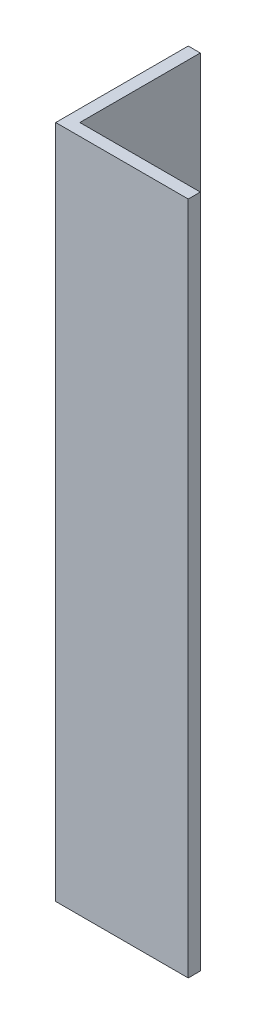
ISO-10303-21;
HEADER;
FILE_DESCRIPTION(('STEP AP214'),'2;1');
FILE_NAME('part.step','',(''),(''),'','','');
FILE_SCHEMA(('AUTOMOTIVE_DESIGN { 1 0 10303 214 1 1 1 1 }'));
ENDSEC;
DATA;
#1=APPLICATION_CONTEXT('core data for automotive mechanical design processes');
#2=APPLICATION_PROTOCOL_DEFINITION('international standard','automotive_design',2000,#1);
#3=PRODUCT_CONTEXT('',#1,'mechanical');
#4=PRODUCT('Part','Part','',(#3));
#5=PRODUCT_RELATED_PRODUCT_CATEGORY('part','',(#4));
#6=PRODUCT_DEFINITION_FORMATION('','',#4);
#7=PRODUCT_DEFINITION_CONTEXT('part definition',#1,'design');
#8=PRODUCT_DEFINITION('design','',#6,#7);
#9=PRODUCT_DEFINITION_SHAPE('','',#8);
#10=(LENGTH_UNIT() NAMED_UNIT(*) SI_UNIT(.MILLI.,.METRE.));
#11=(NAMED_UNIT(*) PLANE_ANGLE_UNIT() SI_UNIT($,.RADIAN.));
#12=(NAMED_UNIT(*) SI_UNIT($,.STERADIAN.) SOLID_ANGLE_UNIT());
#13=UNCERTAINTY_MEASURE_WITH_UNIT(LENGTH_MEASURE(1.E-05),#10,'distance_accuracy_value','');
#14=(GEOMETRIC_REPRESENTATION_CONTEXT(3) GLOBAL_UNCERTAINTY_ASSIGNED_CONTEXT((#13)) GLOBAL_UNIT_ASSIGNED_CONTEXT((#10,
#11,#12)) REPRESENTATION_CONTEXT('',''));
#15=CARTESIAN_POINT('',(0.,0.,0.));
#16=DIRECTION('',(0.,0.,1.));
#17=DIRECTION('',(1.,0.,0.));
#18=AXIS2_PLACEMENT_3D('',#15,#16,#17);
#19=CARTESIAN_POINT('',(-2.,112.,1.07187339486148));
#20=DIRECTION('',(0.,0.,1.));
#21=DIRECTION('',(1.,0.,0.));
#22=AXIS2_PLACEMENT_3D('',#19,#20,#21);
#23=PLANE('',#22);
#24=DIRECTION('',(-1.,0.,0.));
#25=VECTOR('',#24,1.);
#26=CARTESIAN_POINT('',(-2.,0.,1.07187339486148));
#27=LINE('',#26,#25);
#28=CARTESIAN_POINT('',(0.,0.,1.07187339486148));
#29=VERTEX_POINT('',#28);
#30=CARTESIAN_POINT('',(-2.,0.,1.07187339486148));
#31=VERTEX_POINT('',#30);
#32=EDGE_CURVE('E116',#29,#31,#27,.T.);
#33=ORIENTED_EDGE('',*,*,#32,.T.);
#34=DIRECTION('',(0.,-1.,0.));
#35=VECTOR('',#34,1.);
#36=CARTESIAN_POINT('',(-2.,112.,1.07187339486148));
#37=LINE('',#36,#35);
#38=CARTESIAN_POINT('',(-2.,112.,1.07187339486148));
#39=VERTEX_POINT('',#38);
#40=EDGE_CURVE('E11',#39,#31,#37,.T.);
#41=ORIENTED_EDGE('',*,*,#40,.F.);
#42=DIRECTION('',(-1.,0.,0.));
#43=VECTOR('',#42,1.);
#44=CARTESIAN_POINT('',(-2.,112.,1.07187339486148));
#45=LINE('',#44,#43);
#46=CARTESIAN_POINT('',(0.,112.,1.07187339486148));
#47=VERTEX_POINT('',#46);
#48=EDGE_CURVE('E126',#47,#39,#45,.T.);
#49=ORIENTED_EDGE('',*,*,#48,.F.);
#50=DIRECTION('',(0.,-1.,0.));
#51=VECTOR('',#50,1.);
#52=CARTESIAN_POINT('',(0.,112.,1.07187339486148));
#53=LINE('',#52,#51);
#54=EDGE_CURVE('E112',#47,#29,#53,.T.);
#55=ORIENTED_EDGE('',*,*,#54,.T.);
#56=EDGE_LOOP('',(#33,#41,#49,#55));
#57=FACE_BOUND('',#56,.T.);
#58=ADVANCED_FACE('F32',(#57),#23,.F.);
#59=CARTESIAN_POINT('',(-2.,112.,23.0718733948615));
#60=DIRECTION('',(1.,0.,0.));
#61=DIRECTION('',(0.,0.,-1.));
#62=AXIS2_PLACEMENT_3D('',#59,#60,#61);
#63=PLANE('',#62);
#64=DIRECTION('',(0.,0.,1.));
#65=VECTOR('',#64,1.);
#66=CARTESIAN_POINT('',(-2.,0.,23.0718733948615));
#67=LINE('',#66,#65);
#68=CARTESIAN_POINT('',(-2.,0.,23.0718733948615));
#69=VERTEX_POINT('',#68);
#70=EDGE_CURVE('E119',#31,#69,#67,.T.);
#71=ORIENTED_EDGE('',*,*,#70,.T.);
#72=DIRECTION('',(0.,-1.,0.));
#73=VECTOR('',#72,1.);
#74=CARTESIAN_POINT('',(-2.,112.,23.0718733948615));
#75=LINE('',#74,#73);
#76=CARTESIAN_POINT('',(-2.,112.,23.0718733948615));
#77=VERTEX_POINT('',#76);
#78=EDGE_CURVE('E40',#77,#69,#75,.T.);
#79=ORIENTED_EDGE('',*,*,#78,.F.);
#80=DIRECTION('',(0.,0.,1.));
#81=VECTOR('',#80,1.);
#82=CARTESIAN_POINT('',(-2.,112.,23.0718733948615));
#83=LINE('',#82,#81);
#84=EDGE_CURVE('E85',#39,#77,#83,.T.);
#85=ORIENTED_EDGE('',*,*,#84,.F.);
#86=ORIENTED_EDGE('',*,*,#40,.T.);
#87=EDGE_LOOP('',(#71,#79,#85,#86));
#88=FACE_BOUND('',#87,.T.);
#89=ADVANCED_FACE('F150',(#88),#63,.F.);
#90=CARTESIAN_POINT('',(20.,112.,23.0718733948615));
#91=DIRECTION('',(0.,0.,-1.));
#92=DIRECTION('',(-1.,0.,0.));
#93=AXIS2_PLACEMENT_3D('',#90,#91,#92);
#94=PLANE('',#93);
#95=DIRECTION('',(1.,0.,0.));
#96=VECTOR('',#95,1.);
#97=CARTESIAN_POINT('',(20.,0.,23.0718733948615));
#98=LINE('',#97,#96);
#99=CARTESIAN_POINT('',(20.,0.,23.0718733948615));
#100=VERTEX_POINT('',#99);
#101=EDGE_CURVE('E121',#69,#100,#98,.T.);
#102=ORIENTED_EDGE('',*,*,#101,.T.);
#103=DIRECTION('',(0.,-1.,0.));
#104=VECTOR('',#103,1.);
#105=CARTESIAN_POINT('',(20.,112.,23.0718733948615));
#106=LINE('',#105,#104);
#107=CARTESIAN_POINT('',(20.,112.,23.0718733948615));
#108=VERTEX_POINT('',#107);
#109=EDGE_CURVE('E107',#108,#100,#106,.T.);
#110=ORIENTED_EDGE('',*,*,#109,.F.);
#111=DIRECTION('',(1.,0.,0.));
#112=VECTOR('',#111,1.);
#113=CARTESIAN_POINT('',(20.,112.,23.0718733948615));
#114=LINE('',#113,#112);
#115=EDGE_CURVE('E98',#77,#108,#114,.T.);
#116=ORIENTED_EDGE('',*,*,#115,.F.);
#117=ORIENTED_EDGE('',*,*,#78,.T.);
#118=EDGE_LOOP('',(#102,#110,#116,#117));
#119=FACE_BOUND('',#118,.T.);
#120=ADVANCED_FACE('F132',(#119),#94,.F.);
#121=CARTESIAN_POINT('',(20.,112.,21.0718733948615));
#122=DIRECTION('',(-1.,0.,0.));
#123=DIRECTION('',(0.,0.,1.));
#124=AXIS2_PLACEMENT_3D('',#121,#122,#123);
#125=PLANE('',#124);
#126=DIRECTION('',(0.,0.,-1.));
#127=VECTOR('',#126,1.);
#128=CARTESIAN_POINT('',(20.,0.,21.0718733948615));
#129=LINE('',#128,#127);
#130=CARTESIAN_POINT('',(20.,0.,21.0718733948615));
#131=VERTEX_POINT('',#130);
#132=EDGE_CURVE('E106',#100,#131,#129,.T.);
#133=ORIENTED_EDGE('',*,*,#132,.T.);
#134=DIRECTION('',(0.,-1.,0.));
#135=VECTOR('',#134,1.);
#136=CARTESIAN_POINT('',(20.,112.,21.0718733948615));
#137=LINE('',#136,#135);
#138=CARTESIAN_POINT('',(20.,112.,21.0718733948615));
#139=VERTEX_POINT('',#138);
#140=EDGE_CURVE('E103',#139,#131,#137,.T.);
#141=ORIENTED_EDGE('',*,*,#140,.F.);
#142=DIRECTION('',(0.,0.,-1.));
#143=VECTOR('',#142,1.);
#144=CARTESIAN_POINT('',(20.,112.,21.0718733948615));
#145=LINE('',#144,#143);
#146=EDGE_CURVE('E92',#108,#139,#145,.T.);
#147=ORIENTED_EDGE('',*,*,#146,.F.);
#148=ORIENTED_EDGE('',*,*,#109,.T.);
#149=EDGE_LOOP('',(#133,#141,#147,#148));
#150=FACE_BOUND('',#149,.T.);
#151=ADVANCED_FACE('F104',(#150),#125,.F.);
#152=CARTESIAN_POINT('',(0.,112.,21.0718733948615));
#153=DIRECTION('',(0.,0.,1.));
#154=DIRECTION('',(1.,0.,0.));
#155=AXIS2_PLACEMENT_3D('',#152,#153,#154);
#156=PLANE('',#155);
#157=DIRECTION('',(-1.,0.,0.));
#158=VECTOR('',#157,1.);
#159=CARTESIAN_POINT('',(0.,0.,21.0718733948615));
#160=LINE('',#159,#158);
#161=CARTESIAN_POINT('',(0.,0.,21.0718733948615));
#162=VERTEX_POINT('',#161);
#163=EDGE_CURVE('E71',#131,#162,#160,.T.);
#164=ORIENTED_EDGE('',*,*,#163,.T.);
#165=DIRECTION('',(0.,-1.,0.));
#166=VECTOR('',#165,1.);
#167=CARTESIAN_POINT('',(0.,112.,21.0718733948615));
#168=LINE('',#167,#166);
#169=CARTESIAN_POINT('',(0.,112.,21.0718733948615));
#170=VERTEX_POINT('',#169);
#171=EDGE_CURVE('E108',#170,#162,#168,.T.);
#172=ORIENTED_EDGE('',*,*,#171,.F.);
#173=DIRECTION('',(-1.,0.,0.));
#174=VECTOR('',#173,1.);
#175=CARTESIAN_POINT('',(0.,112.,21.0718733948615));
#176=LINE('',#175,#174);
#177=EDGE_CURVE('E96',#139,#170,#176,.T.);
#178=ORIENTED_EDGE('',*,*,#177,.F.);
#179=ORIENTED_EDGE('',*,*,#140,.T.);
#180=EDGE_LOOP('',(#164,#172,#178,#179));
#181=FACE_BOUND('',#180,.T.);
#182=ADVANCED_FACE('F110',(#181),#156,.F.);
#183=CARTESIAN_POINT('',(0.,112.,1.07187339486148));
#184=DIRECTION('',(-1.,0.,0.));
#185=DIRECTION('',(0.,0.,1.));
#186=AXIS2_PLACEMENT_3D('',#183,#184,#185);
#187=PLANE('',#186);
#188=DIRECTION('',(0.,0.,-1.));
#189=VECTOR('',#188,1.);
#190=CARTESIAN_POINT('',(0.,0.,1.07187339486148));
#191=LINE('',#190,#189);
#192=EDGE_CURVE('E77',#162,#29,#191,.T.);
#193=ORIENTED_EDGE('',*,*,#192,.T.);
#194=ORIENTED_EDGE('',*,*,#54,.F.);
#195=DIRECTION('',(0.,0.,-1.));
#196=VECTOR('',#195,1.);
#197=CARTESIAN_POINT('',(0.,112.,1.07187339486148));
#198=LINE('',#197,#196);
#199=EDGE_CURVE('E48',#170,#47,#198,.T.);
#200=ORIENTED_EDGE('',*,*,#199,.F.);
#201=ORIENTED_EDGE('',*,*,#171,.T.);
#202=EDGE_LOOP('',(#193,#194,#200,#201));
#203=FACE_BOUND('',#202,.T.);
#204=ADVANCED_FACE('F139',(#203),#187,.F.);
#205=CARTESIAN_POINT('',(0.,112.,1.07187339486148));
#206=DIRECTION('',(0.,-1.,0.));
#207=DIRECTION('',(0.,0.,-1.));
#208=AXIS2_PLACEMENT_3D('',#205,#206,#207);
#209=PLANE('',#208);
#210=ORIENTED_EDGE('',*,*,#48,.T.);
#211=ORIENTED_EDGE('',*,*,#84,.T.);
#212=ORIENTED_EDGE('',*,*,#115,.T.);
#213=ORIENTED_EDGE('',*,*,#146,.T.);
#214=ORIENTED_EDGE('',*,*,#177,.T.);
#215=ORIENTED_EDGE('',*,*,#199,.T.);
#216=EDGE_LOOP('',(#210,#211,#212,#213,#214,#215));
#217=FACE_BOUND('',#216,.T.);
#218=ADVANCED_FACE('F94',(#217),#209,.F.);
#219=CARTESIAN_POINT('',(0.,0.,1.07187339486148));
#220=DIRECTION('',(0.,-1.,0.));
#221=DIRECTION('',(0.,0.,-1.));
#222=AXIS2_PLACEMENT_3D('',#219,#220,#221);
#223=PLANE('',#222);
#224=ORIENTED_EDGE('',*,*,#32,.F.);
#225=ORIENTED_EDGE('',*,*,#192,.F.);
#226=ORIENTED_EDGE('',*,*,#163,.F.);
#227=ORIENTED_EDGE('',*,*,#132,.F.);
#228=ORIENTED_EDGE('',*,*,#101,.F.);
#229=ORIENTED_EDGE('',*,*,#70,.F.);
#230=EDGE_LOOP('',(#224,#225,#226,#227,#228,#229));
#231=FACE_BOUND('',#230,.T.);
#232=ADVANCED_FACE('F135',(#231),#223,.T.);
#233=CLOSED_SHELL('',(#58,#89,#120,#151,#182,#204,#218,#232));
#234=MANIFOLD_SOLID_BREP('B2',#233);
#235=ADVANCED_BREP_SHAPE_REPRESENTATION('',(#18,#234),#14);
#236=SHAPE_DEFINITION_REPRESENTATION(#9,#235);
ENDSEC;
END-ISO-10303-21;
